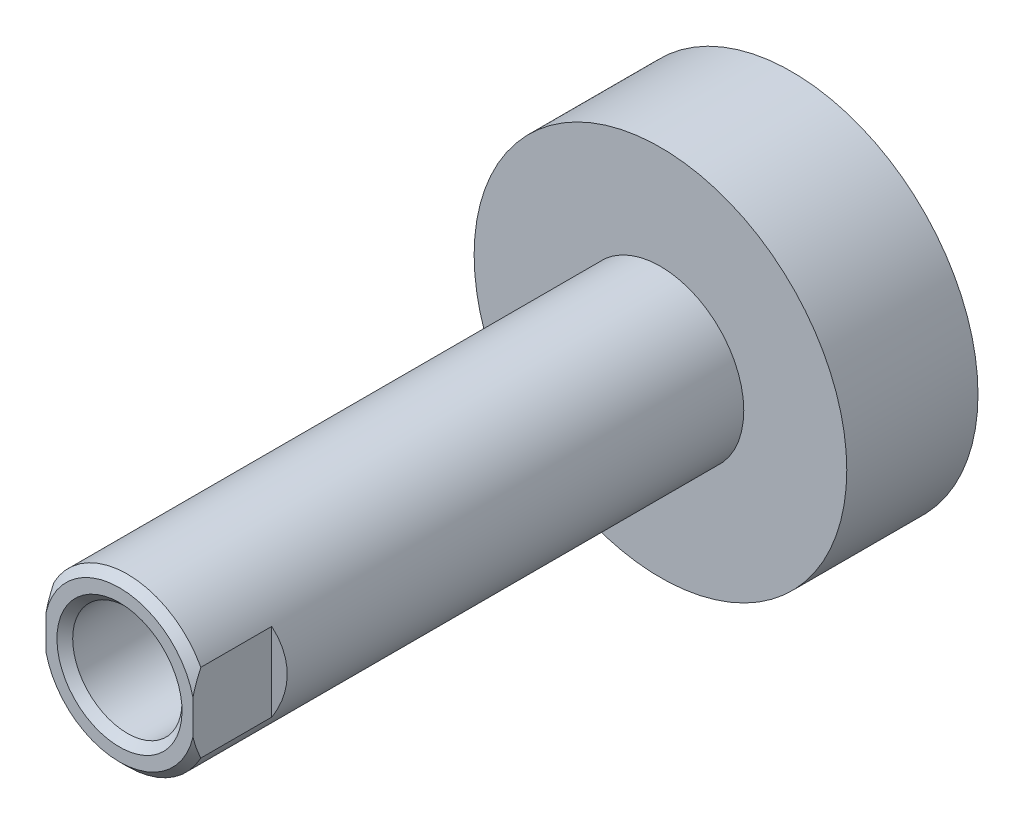
ISO-10303-21;
HEADER;
FILE_DESCRIPTION(('STEP AP214'),'2;1');
FILE_NAME('part.step','',(''),(''),'','','');
FILE_SCHEMA(('AUTOMOTIVE_DESIGN { 1 0 10303 214 1 1 1 1 }'));
ENDSEC;
DATA;
#1=APPLICATION_CONTEXT('core data for automotive mechanical design processes');
#2=APPLICATION_PROTOCOL_DEFINITION('international standard','automotive_design',2000,#1);
#3=PRODUCT_CONTEXT('',#1,'mechanical');
#4=PRODUCT('Part','Part','',(#3));
#5=PRODUCT_RELATED_PRODUCT_CATEGORY('part','',(#4));
#6=PRODUCT_DEFINITION_FORMATION('','',#4);
#7=PRODUCT_DEFINITION_CONTEXT('part definition',#1,'design');
#8=PRODUCT_DEFINITION('design','',#6,#7);
#9=PRODUCT_DEFINITION_SHAPE('','',#8);
#10=(LENGTH_UNIT() NAMED_UNIT(*) SI_UNIT(.MILLI.,.METRE.));
#11=(NAMED_UNIT(*) PLANE_ANGLE_UNIT() SI_UNIT($,.RADIAN.));
#12=(NAMED_UNIT(*) SI_UNIT($,.STERADIAN.) SOLID_ANGLE_UNIT());
#13=UNCERTAINTY_MEASURE_WITH_UNIT(LENGTH_MEASURE(1.E-05),#10,'distance_accuracy_value','');
#14=(GEOMETRIC_REPRESENTATION_CONTEXT(3) GLOBAL_UNCERTAINTY_ASSIGNED_CONTEXT((#13)) GLOBAL_UNIT_ASSIGNED_CONTEXT((#10,
#11,#12)) REPRESENTATION_CONTEXT('',''));
#15=CARTESIAN_POINT('',(0.,0.,0.));
#16=DIRECTION('',(0.,0.,1.));
#17=DIRECTION('',(1.,0.,0.));
#18=AXIS2_PLACEMENT_3D('',#15,#16,#17);
#19=CARTESIAN_POINT('',(0.,0.,25.614));
#20=DIRECTION('',(0.,0.,-1.));
#21=DIRECTION('',(-1.,0.,0.));
#22=AXIS2_PLACEMENT_3D('',#19,#20,#21);
#23=CONICAL_SURFACE('',#22,2.875,0.785398163397448);
#24=CARTESIAN_POINT('',(2.8,6.40409288585039,21.4995504014551));
#25=CARTESIAN_POINT('',(2.8,6.21530131402021,21.6724791142946));
#26=CARTESIAN_POINT('',(2.8,6.02594277949216,21.8447983655281));
#27=CARTESIAN_POINT('',(2.8,5.64560917698831,22.1877342817093));
#28=CARTESIAN_POINT('',(2.8,5.45463373183103,22.3583505279696));
#29=CARTESIAN_POINT('',(2.8,5.0693993005037,22.698438486706));
#30=CARTESIAN_POINT('',(2.8,4.87512693210801,22.8678950791546));
#31=CARTESIAN_POINT('',(2.8,4.48388823614274,23.2036313887583));
#32=CARTESIAN_POINT('',(2.8,4.28692225071637,23.3699115030752));
#33=CARTESIAN_POINT('',(2.8,3.92252866507081,23.670547193242));
#34=CARTESIAN_POINT('',(2.8,3.7556707956785,23.8055906179416));
#35=CARTESIAN_POINT('',(2.8,3.41848834775856,24.0713896916909));
#36=CARTESIAN_POINT('',(2.8,3.24816284560576,24.2021441734836));
#37=CARTESIAN_POINT('',(2.8,2.90310026082264,24.4573200193591));
#38=CARTESIAN_POINT('',(2.8,2.72836898816857,24.5817491319853));
#39=CARTESIAN_POINT('',(2.8,2.46159360059418,24.7613775075954));
#40=CARTESIAN_POINT('',(2.8,2.37190693686156,24.8200734947239));
#41=CARTESIAN_POINT('',(2.8,2.19069178803803,24.9345403791412));
#42=CARTESIAN_POINT('',(2.8,2.09916353869147,24.9903116475729));
#43=CARTESIAN_POINT('',(2.8,1.91535619256872,25.0973786837929));
#44=CARTESIAN_POINT('',(2.8,1.82310918445454,25.1487292209963));
#45=CARTESIAN_POINT('',(2.8,1.6362600728144,25.2469280610082));
#46=CARTESIAN_POINT('',(2.8,1.54165859274646,25.2937775400462));
#47=CARTESIAN_POINT('',(2.8,1.34992491480377,25.3817423789926));
#48=CARTESIAN_POINT('',(2.8,1.25279557260694,25.4228639021425));
#49=CARTESIAN_POINT('',(2.8,1.05579132027353,25.497944220849));
#50=CARTESIAN_POINT('',(2.8,0.955917202290746,25.5319050589735));
#51=CARTESIAN_POINT('',(2.8,0.774015610001933,25.5850128160452));
#52=CARTESIAN_POINT('',(2.8,0.692459969683738,25.605766485837));
#53=CARTESIAN_POINT('',(2.8,0.527974791108671,25.6407885828827));
#54=CARTESIAN_POINT('',(2.8,0.445045717822605,25.6550591602577));
#55=CARTESIAN_POINT('',(2.8,0.278459436251525,25.6763967953165));
#56=CARTESIAN_POINT('',(2.8,0.194804513514793,25.6834814400774));
#57=CARTESIAN_POINT('',(2.8,0.0271926983587925,25.6901200407255));
#58=CARTESIAN_POINT('',(2.8,-0.0567641889013705,25.689674124668));
#59=CARTESIAN_POINT('',(2.8,-0.224256787386011,25.6812791669753));
#60=CARTESIAN_POINT('',(2.8,-0.307792675606,25.6733335991373));
#61=CARTESIAN_POINT('',(2.8,-0.473890294720259,25.6503734951748));
#62=CARTESIAN_POINT('',(2.8,-0.556451813717623,25.6353574494422));
#63=CARTESIAN_POINT('',(2.8,-0.720378465833271,25.5989246360367));
#64=CARTESIAN_POINT('',(2.8,-0.8017395223032,25.5774897621309));
#65=CARTESIAN_POINT('',(2.8,-0.962778849550997,25.5290943027323));
#66=CARTESIAN_POINT('',(2.8,-1.04245714605221,25.5021338017738));
#67=CARTESIAN_POINT('',(2.8,-1.21987368113353,25.4361807538754));
#68=CARTESIAN_POINT('',(2.8,-1.31711815376235,25.3958671833215));
#69=CARTESIAN_POINT('',(2.8,-1.5090017068583,25.3094178174973));
#70=CARTESIAN_POINT('',(2.8,-1.60363955018692,25.2632793137298));
#71=CARTESIAN_POINT('',(2.8,-1.79068294250205,25.1663296497851));
#72=CARTESIAN_POINT('',(2.8,-1.88308428843928,25.1155104419594));
#73=CARTESIAN_POINT('',(2.8,-2.06579163515274,25.0102183243824));
#74=CARTESIAN_POINT('',(2.8,-2.15609721381248,24.9557446870287));
#75=CARTESIAN_POINT('',(2.8,-2.33581888189109,24.8433062497768));
#76=CARTESIAN_POINT('',(2.8,-2.42521574452043,24.7853108566371));
#77=CARTESIAN_POINT('',(2.8,-2.60241554860162,24.6669282900505));
#78=CARTESIAN_POINT('',(2.8,-2.69021835064669,24.6065409088705));
#79=CARTESIAN_POINT('',(2.8,-2.95163931230513,24.4224562849015));
#80=CARTESIAN_POINT('',(2.8,-3.12322091808284,24.2958679924581));
#81=CARTESIAN_POINT('',(2.8,-3.43143863596196,24.0610457530675));
#82=CARTESIAN_POINT('',(2.8,-3.56874079757334,23.9536750622679));
#83=CARTESIAN_POINT('',(2.8,-3.84120420423017,23.7363065843494));
#84=CARTESIAN_POINT('',(2.8,-3.97636586386936,23.6263093165843));
#85=CARTESIAN_POINT('',(2.8,-4.2450954333917,23.4042072896423));
#86=CARTESIAN_POINT('',(2.8,-4.37866219761083,23.2921011488778));
#87=CARTESIAN_POINT('',(2.8,-4.64443688882981,23.0662794076185));
#88=CARTESIAN_POINT('',(2.8,-4.77664474964283,22.9525637293646));
#89=CARTESIAN_POINT('',(2.8,-5.16103062136355,22.6186969018967));
#90=CARTESIAN_POINT('',(2.8,-5.41172447055859,22.3968373546205));
#91=CARTESIAN_POINT('',(2.8,-5.78548758602015,22.0618019699764));
#92=CARTESIAN_POINT('',(2.8,-5.90962703562808,21.9498122892259));
#93=CARTESIAN_POINT('',(2.8,-6.15729395528682,21.7251586496859));
#94=CARTESIAN_POINT('',(2.8,-6.28082142680383,21.6124946925134));
#95=CARTESIAN_POINT('',(2.8,-6.40409288585039,21.4995504014551));
#96=B_SPLINE_CURVE_WITH_KNOTS('',3,(#24,#25,#26,#27,#28,#29,#30,#31,#32,#33,#34,#35,#36,#37,#38,
#39,#40,#41,#42,#43,#44,#45,#46,#47,#48,#49,#50,#51,#52,#53,#54,#55,#56,#57,#58,#59,#60,#61,#62,
#63,#64,#65,#66,#67,#68,#69,#70,#71,#72,#73,#74,#75,#76,#77,#78,#79,#80,#81,#82,#83,#84,#85,#86,
#87,#88,#89,#90,#91,#92,#93,#94,#95),.UNSPECIFIED.,.F.,.F.,(4,2,2,2,2,2,2,2,2,2,2,2,2,2,2,2,2,2,
2,2,2,2,2,2,2,2,2,2,2,2,2,2,2,2,2,4),(0.,0.768070465982802,1.5363253295418,2.3096809370453,
3.08293920886111,3.72686189949449,4.37095840685429,5.01424588420809,5.33576238949962,
5.65723799555331,5.97387016639603,6.29041936764638,6.60662528866313,6.92274089032021,
7.17497877598581,7.42713294564482,7.67866848525018,7.93019974755985,8.18161455912571,
8.4330830742841,8.68526772293323,8.93744851379239,9.25300704333975,9.56871284654274,
9.88497196065974,10.2012942304021,10.5209300388869,10.840593667401,11.4800956660014,
12.0029633797013,12.5257285490226,13.0488490267358,13.571994863987,14.5762479594562,
15.0778149878801,15.5793808140611),.UNSPECIFIED.);
#97=CARTESIAN_POINT('',(2.8,1.49687173799227,25.314));
#98=VERTEX_POINT('',#97);
#99=CARTESIAN_POINT('',(2.8,0.652399417534981,25.614));
#100=VERTEX_POINT('',#99);
#101=EDGE_CURVE('E42',#98,#100,#96,.T.);
#102=ORIENTED_EDGE('',*,*,#101,.F.);
#103=CARTESIAN_POINT('',(0.,0.,25.314));
#104=DIRECTION('',(0.,0.,-1.));
#105=DIRECTION('',(-1.,0.,0.));
#106=AXIS2_PLACEMENT_3D('',#103,#104,#105);
#107=CIRCLE('',#106,3.175);
#108=CARTESIAN_POINT('',(-2.8,1.49687173799227,25.314));
#109=VERTEX_POINT('',#108);
#110=EDGE_CURVE('E114',#109,#98,#107,.T.);
#111=ORIENTED_EDGE('',*,*,#110,.F.);
#112=CARTESIAN_POINT('',(-2.8,-6.40409288585039,21.4995504014551));
#113=CARTESIAN_POINT('',(-2.8,-6.21530131402021,21.6724791142946));
#114=CARTESIAN_POINT('',(-2.8,-6.02594277949216,21.8447983655281));
#115=CARTESIAN_POINT('',(-2.8,-5.64560917698831,22.1877342817093));
#116=CARTESIAN_POINT('',(-2.8,-5.45463373183103,22.3583505279696));
#117=CARTESIAN_POINT('',(-2.8,-5.0693993005037,22.698438486706));
#118=CARTESIAN_POINT('',(-2.8,-4.87512693210801,22.8678950791546));
#119=CARTESIAN_POINT('',(-2.8,-4.48388823614274,23.2036313887583));
#120=CARTESIAN_POINT('',(-2.8,-4.28692225071637,23.3699115030752));
#121=CARTESIAN_POINT('',(-2.8,-3.92252866507082,23.670547193242));
#122=CARTESIAN_POINT('',(-2.8,-3.7556707956785,23.8055906179416));
#123=CARTESIAN_POINT('',(-2.8,-3.41848834775857,24.0713896916909));
#124=CARTESIAN_POINT('',(-2.8,-3.24816284560576,24.2021441734836));
#125=CARTESIAN_POINT('',(-2.8,-2.90310026082264,24.4573200193591));
#126=CARTESIAN_POINT('',(-2.8,-2.72836898816858,24.5817491319853));
#127=CARTESIAN_POINT('',(-2.8,-2.46159360059419,24.7613775075954));
#128=CARTESIAN_POINT('',(-2.8,-2.37190693686157,24.8200734947239));
#129=CARTESIAN_POINT('',(-2.8,-2.19069178803804,24.9345403791412));
#130=CARTESIAN_POINT('',(-2.8,-2.09916353869148,24.9903116475729));
#131=CARTESIAN_POINT('',(-2.8,-1.91535619256873,25.0973786837929));
#132=CARTESIAN_POINT('',(-2.8,-1.82310918445455,25.1487292209963));
#133=CARTESIAN_POINT('',(-2.8,-1.63626007281441,25.2469280610082));
#134=CARTESIAN_POINT('',(-2.8,-1.54165859274646,25.2937775400462));
#135=CARTESIAN_POINT('',(-2.8,-1.34992491480378,25.3817423789926));
#136=CARTESIAN_POINT('',(-2.8,-1.25279557260694,25.4228639021425));
#137=CARTESIAN_POINT('',(-2.8,-1.05579132027354,25.497944220849));
#138=CARTESIAN_POINT('',(-2.8,-0.955917202290754,25.5319050589735));
#139=CARTESIAN_POINT('',(-2.8,-0.774015610001941,25.5850128160452));
#140=CARTESIAN_POINT('',(-2.8,-0.692459969683747,25.605766485837));
#141=CARTESIAN_POINT('',(-2.8,-0.527974791108681,25.6407885828827));
#142=CARTESIAN_POINT('',(-2.8,-0.445045717822614,25.6550591602577));
#143=CARTESIAN_POINT('',(-2.8,-0.278459436251534,25.6763967953165));
#144=CARTESIAN_POINT('',(-2.8,-0.194804513514802,25.6834814400774));
#145=CARTESIAN_POINT('',(-2.8,-0.0271926983588019,25.6901200407255));
#146=CARTESIAN_POINT('',(-2.8,0.056764188901361,25.689674124668));
#147=CARTESIAN_POINT('',(-2.8,0.224256787386001,25.6812791669753));
#148=CARTESIAN_POINT('',(-2.8,0.30779267560599,25.6733335991373));
#149=CARTESIAN_POINT('',(-2.8,0.473890294720248,25.6503734951748));
#150=CARTESIAN_POINT('',(-2.8,0.556451813717612,25.6353574494422));
#151=CARTESIAN_POINT('',(-2.8,0.720378465833261,25.5989246360367));
#152=CARTESIAN_POINT('',(-2.8,0.801739522303191,25.5774897621309));
#153=CARTESIAN_POINT('',(-2.8,0.962778849550988,25.5290943027323));
#154=CARTESIAN_POINT('',(-2.8,1.0424571460522,25.5021338017738));
#155=CARTESIAN_POINT('',(-2.8,1.21987368113352,25.4361807538754));
#156=CARTESIAN_POINT('',(-2.8,1.31711815376234,25.3958671833215));
#157=CARTESIAN_POINT('',(-2.8,1.50900170685829,25.3094178174973));
#158=CARTESIAN_POINT('',(-2.8,1.60363955018691,25.2632793137298));
#159=CARTESIAN_POINT('',(-2.8,1.79068294250204,25.1663296497851));
#160=CARTESIAN_POINT('',(-2.8,1.88308428843926,25.1155104419594));
#161=CARTESIAN_POINT('',(-2.8,2.06579163515272,25.0102183243824));
#162=CARTESIAN_POINT('',(-2.8,2.15609721381246,24.9557446870287));
#163=CARTESIAN_POINT('',(-2.8,2.33581888189107,24.8433062497769));
#164=CARTESIAN_POINT('',(-2.8,2.42521574452041,24.7853108566371));
#165=CARTESIAN_POINT('',(-2.8,2.60241554860159,24.6669282900505));
#166=CARTESIAN_POINT('',(-2.8,2.69021835064666,24.6065409088705));
#167=CARTESIAN_POINT('',(-2.8,2.9516393123051,24.4224562849015));
#168=CARTESIAN_POINT('',(-2.8,3.12322091808282,24.2958679924581));
#169=CARTESIAN_POINT('',(-2.8,3.43143863596193,24.0610457530675));
#170=CARTESIAN_POINT('',(-2.8,3.56874079757331,23.9536750622679));
#171=CARTESIAN_POINT('',(-2.8,3.84120420423014,23.7363065843494));
#172=CARTESIAN_POINT('',(-2.8,3.97636586386934,23.6263093165843));
#173=CARTESIAN_POINT('',(-2.8,4.24509543339167,23.4042072896423));
#174=CARTESIAN_POINT('',(-2.8,4.37866219761081,23.2921011488779));
#175=CARTESIAN_POINT('',(-2.8,4.64443688882979,23.0662794076186));
#176=CARTESIAN_POINT('',(-2.8,4.77664474964281,22.9525637293647));
#177=CARTESIAN_POINT('',(-2.8,5.16103062136353,22.6186969018967));
#178=CARTESIAN_POINT('',(-2.8,5.41172447055858,22.3968373546205));
#179=CARTESIAN_POINT('',(-2.8,5.78548758602014,22.0618019699764));
#180=CARTESIAN_POINT('',(-2.8,5.90962703562807,21.9498122892259));
#181=CARTESIAN_POINT('',(-2.8,6.15729395528682,21.7251586496859));
#182=CARTESIAN_POINT('',(-2.8,6.28082142680382,21.6124946925134));
#183=CARTESIAN_POINT('',(-2.8,6.40409288585039,21.4995504014551));
#184=B_SPLINE_CURVE_WITH_KNOTS('',3,(#112,#113,#114,#115,#116,#117,#118,#119,#120,#121,#122,
#123,#124,#125,#126,#127,#128,#129,#130,#131,#132,#133,#134,#135,#136,#137,#138,#139,#140,#141,
#142,#143,#144,#145,#146,#147,#148,#149,#150,#151,#152,#153,#154,#155,#156,#157,#158,#159,#160,
#161,#162,#163,#164,#165,#166,#167,#168,#169,#170,#171,#172,#173,#174,#175,#176,#177,#178,#179,
#180,#181,#182,#183),.UNSPECIFIED.,.F.,.F.,(4,2,2,2,2,2,2,2,2,2,2,2,2,2,2,2,2,2,2,2,2,2,2,2,2,2,
2,2,2,2,2,2,2,2,2,4),(0.,0.768070465982802,1.5363253295418,2.3096809370453,3.08293920886111,
3.72686189949449,4.37095840685428,5.01424588420809,5.33576238949961,5.6572379955533,
5.97387016639602,6.29041936764637,6.60662528866312,6.9227408903202,7.1749787759858,
7.42713294564481,7.67866848525017,7.93019974755985,8.1816145591257,8.43308307428408,
8.68526772293322,8.93744851379238,9.25300704333974,9.56871284654273,9.88497196065972,
10.2012942304021,10.5209300388869,10.840593667401,11.4800956660014,12.0029633797013,
12.5257285490225,13.0488490267357,13.571994863987,14.5762479594562,15.0778149878801,
15.5793808140611),.UNSPECIFIED.);
#185=CARTESIAN_POINT('',(-2.8,0.652399417534996,25.614));
#186=VERTEX_POINT('',#185);
#187=EDGE_CURVE('E105',#186,#109,#184,.T.);
#188=ORIENTED_EDGE('',*,*,#187,.F.);
#189=CARTESIAN_POINT('',(0.,0.,25.614));
#190=DIRECTION('',(0.,0.,-1.));
#191=DIRECTION('',(0.,1.,0.));
#192=AXIS2_PLACEMENT_3D('',#189,#190,#191);
#193=CIRCLE('',#192,2.875);
#194=EDGE_CURVE('E56',#100,#186,#193,.F.);
#195=ORIENTED_EDGE('',*,*,#194,.F.);
#196=EDGE_LOOP('',(#102,#111,#188,#195));
#197=FACE_BOUND('',#196,.T.);
#198=ADVANCED_FACE('F34',(#197),#23,.T.);
#199=CARTESIAN_POINT('',(0.,0.,5.));
#200=DIRECTION('',(0.,0.,-1.));
#201=DIRECTION('',(-1.,0.,0.));
#202=AXIS2_PLACEMENT_3D('',#199,#200,#201);
#203=CYLINDRICAL_SURFACE('',#202,7.1);
#204=CARTESIAN_POINT('',(0.,0.,5.));
#205=DIRECTION('',(0.,0.,1.));
#206=DIRECTION('',(1.,0.,0.));
#207=AXIS2_PLACEMENT_3D('',#204,#205,#206);
#208=CIRCLE('',#207,7.1);
#209=CARTESIAN_POINT('',(7.1,0.,5.));
#210=VERTEX_POINT('',#209);
#211=EDGE_CURVE('E179',#210,#210,#208,.T.);
#212=ORIENTED_EDGE('',*,*,#211,.F.);
#213=EDGE_LOOP('',(#212));
#214=FACE_BOUND('',#213,.T.);
#215=CARTESIAN_POINT('',(0.,0.,0.));
#216=DIRECTION('',(0.,0.,1.));
#217=DIRECTION('',(1.,0.,0.));
#218=AXIS2_PLACEMENT_3D('',#215,#216,#217);
#219=CIRCLE('',#218,7.1);
#220=CARTESIAN_POINT('',(7.1,0.,0.));
#221=VERTEX_POINT('',#220);
#222=EDGE_CURVE('E182',#221,#221,#219,.T.);
#223=ORIENTED_EDGE('',*,*,#222,.T.);
#224=EDGE_LOOP('',(#223));
#225=FACE_BOUND('',#224,.T.);
#226=ADVANCED_FACE('F167',(#214,#225),#203,.T.);
#227=CARTESIAN_POINT('',(0.,0.,5.));
#228=DIRECTION('',(0.,0.,1.));
#229=DIRECTION('',(1.,0.,0.));
#230=AXIS2_PLACEMENT_3D('',#227,#228,#229);
#231=PLANE('',#230);
#232=CARTESIAN_POINT('',(0.,0.,5.));
#233=DIRECTION('',(0.,0.,1.));
#234=DIRECTION('',(1.,0.,0.));
#235=AXIS2_PLACEMENT_3D('',#232,#233,#234);
#236=CIRCLE('',#235,3.175);
#237=CARTESIAN_POINT('',(3.175,0.,5.));
#238=VERTEX_POINT('',#237);
#239=EDGE_CURVE('E110',#238,#238,#236,.T.);
#240=ORIENTED_EDGE('',*,*,#239,.F.);
#241=EDGE_LOOP('',(#240));
#242=FACE_BOUND('',#241,.T.);
#243=ORIENTED_EDGE('',*,*,#211,.T.);
#244=EDGE_LOOP('',(#243));
#245=FACE_BOUND('',#244,.T.);
#246=ADVANCED_FACE('F164',(#242,#245),#231,.T.);
#247=CARTESIAN_POINT('',(0.,0.,0.));
#248=DIRECTION('',(0.,0.,1.));
#249=DIRECTION('',(1.,0.,0.));
#250=AXIS2_PLACEMENT_3D('',#247,#248,#249);
#251=PLANE('',#250);
#252=ORIENTED_EDGE('',*,*,#222,.F.);
#253=EDGE_LOOP('',(#252));
#254=FACE_BOUND('',#253,.T.);
#255=ADVANCED_FACE('F162',(#254),#251,.F.);
#256=CARTESIAN_POINT('',(0.,0.,34.5942561210692));
#257=DIRECTION('',(0.,0.,-1.));
#258=DIRECTION('',(-1.,0.,0.));
#259=AXIS2_PLACEMENT_3D('',#256,#257,#258);
#260=CYLINDRICAL_SURFACE('',#259,3.175);
#261=DIRECTION('',(0.,0.,-1.));
#262=VECTOR('',#261,1.);
#263=CARTESIAN_POINT('',(2.8,1.49687173799227,34.5942561210692));
#264=LINE('',#263,#262);
#265=CARTESIAN_POINT('',(2.8,1.49687173799227,22.614));
#266=VERTEX_POINT('',#265);
#267=EDGE_CURVE('E91',#266,#98,#264,.F.);
#268=ORIENTED_EDGE('',*,*,#267,.F.);
#269=CARTESIAN_POINT('',(0.,0.,24.230580753731));
#270=DIRECTION('',(-0.500000000000004,0.,-0.866025403784436));
#271=DIRECTION('',(0.866025403784436,0.,-0.500000000000004));
#272=AXIS2_PLACEMENT_3D('',#269,#270,#271);
#273=ELLIPSE('',#272,3.66617420935414,3.175);
#274=CARTESIAN_POINT('',(2.8,-1.49687173799227,22.614));
#275=VERTEX_POINT('',#274);
#276=EDGE_CURVE('E12',#275,#266,#273,.F.);
#277=ORIENTED_EDGE('',*,*,#276,.F.);
#278=DIRECTION('',(0.,0.,-1.));
#279=VECTOR('',#278,1.);
#280=CARTESIAN_POINT('',(2.8,-1.49687173799227,34.5942561210692));
#281=LINE('',#280,#279);
#282=CARTESIAN_POINT('',(2.8,-1.49687173799227,25.314));
#283=VERTEX_POINT('',#282);
#284=EDGE_CURVE('E101',#283,#275,#281,.T.);
#285=ORIENTED_EDGE('',*,*,#284,.F.);
#286=CARTESIAN_POINT('',(-2.8,-1.49687173799227,25.314));
#287=VERTEX_POINT('',#286);
#288=EDGE_CURVE('E108',#283,#287,#107,.T.);
#289=ORIENTED_EDGE('',*,*,#288,.T.);
#290=DIRECTION('',(0.,0.,-1.));
#291=VECTOR('',#290,1.);
#292=CARTESIAN_POINT('',(-2.8,-1.49687173799228,34.5942561210692));
#293=LINE('',#292,#291);
#294=CARTESIAN_POINT('',(-2.8,-1.49687173799228,22.614));
#295=VERTEX_POINT('',#294);
#296=EDGE_CURVE('E196',#295,#287,#293,.F.);
#297=ORIENTED_EDGE('',*,*,#296,.F.);
#298=CARTESIAN_POINT('',(0.,0.,24.230580753731));
#299=DIRECTION('',(0.500000000000004,0.,-0.866025403784437));
#300=DIRECTION('',(-0.866025403784437,0.,-0.500000000000004));
#301=AXIS2_PLACEMENT_3D('',#298,#299,#300);
#302=ELLIPSE('',#301,3.66617420935413,3.175);
#303=CARTESIAN_POINT('',(-2.8,1.49687173799228,22.614));
#304=VERTEX_POINT('',#303);
#305=EDGE_CURVE('E125',#304,#295,#302,.F.);
#306=ORIENTED_EDGE('',*,*,#305,.F.);
#307=DIRECTION('',(0.,0.,-1.));
#308=VECTOR('',#307,1.);
#309=CARTESIAN_POINT('',(-2.8,1.49687173799228,34.5942561210692));
#310=LINE('',#309,#308);
#311=EDGE_CURVE('E199',#109,#304,#310,.T.);
#312=ORIENTED_EDGE('',*,*,#311,.F.);
#313=ORIENTED_EDGE('',*,*,#110,.T.);
#314=EDGE_LOOP('',(#268,#277,#285,#289,#297,#306,#312,#313));
#315=FACE_BOUND('',#314,.T.);
#316=ORIENTED_EDGE('',*,*,#239,.T.);
#317=EDGE_LOOP('',(#316));
#318=FACE_BOUND('',#317,.T.);
#319=ADVANCED_FACE('F159',(#315,#318),#260,.T.);
#320=CARTESIAN_POINT('',(0.,0.,25.614));
#321=DIRECTION('',(0.,0.,-1.));
#322=DIRECTION('',(0.,1.,0.));
#323=AXIS2_PLACEMENT_3D('',#320,#321,#322);
#324=PLANE('',#323);
#325=CARTESIAN_POINT('',(-2.8,-0.652399417534996,25.614));
#326=VERTEX_POINT('',#325);
#327=CARTESIAN_POINT('',(2.8,-0.652399417534984,25.614));
#328=VERTEX_POINT('',#327);
#329=EDGE_CURVE('E100',#326,#328,#193,.F.);
#330=ORIENTED_EDGE('',*,*,#329,.T.);
#331=DIRECTION('',(0.,1.,0.));
#332=VECTOR('',#331,1.);
#333=CARTESIAN_POINT('',(2.8,-7.1,25.614));
#334=LINE('',#333,#332);
#335=EDGE_CURVE('E49',#328,#100,#334,.T.);
#336=ORIENTED_EDGE('',*,*,#335,.T.);
#337=ORIENTED_EDGE('',*,*,#194,.T.);
#338=DIRECTION('',(0.,1.,0.));
#339=VECTOR('',#338,1.);
#340=CARTESIAN_POINT('',(-2.8,-7.1,25.614));
#341=LINE('',#340,#339);
#342=EDGE_CURVE('E202',#326,#186,#341,.T.);
#343=ORIENTED_EDGE('',*,*,#342,.F.);
#344=EDGE_LOOP('',(#330,#336,#337,#343));
#345=FACE_BOUND('',#344,.T.);
#346=CARTESIAN_POINT('',(0.,0.,25.614));
#347=DIRECTION('',(0.,0.,-1.));
#348=DIRECTION('',(0.,1.,0.));
#349=AXIS2_PLACEMENT_3D('',#346,#347,#348);
#350=CIRCLE('',#349,2.3828);
#351=CARTESIAN_POINT('',(0.,2.3828,25.614));
#352=VERTEX_POINT('',#351);
#353=EDGE_CURVE('E106',#352,#352,#350,.T.);
#354=ORIENTED_EDGE('',*,*,#353,.T.);
#355=EDGE_LOOP('',(#354));
#356=FACE_BOUND('',#355,.T.);
#357=ADVANCED_FACE('F97',(#345,#356),#324,.F.);
#358=CARTESIAN_POINT('',(0.,0.,25.614));
#359=DIRECTION('',(0.,0.,1.));
#360=DIRECTION('',(0.,-1.,0.));
#361=AXIS2_PLACEMENT_3D('',#358,#359,#360);
#362=CYLINDRICAL_SURFACE('',#361,2.0828);
#363=CARTESIAN_POINT('',(0.,0.,25.314));
#364=DIRECTION('',(0.,0.,-1.));
#365=DIRECTION('',(0.,1.,0.));
#366=AXIS2_PLACEMENT_3D('',#363,#364,#365);
#367=CIRCLE('',#366,2.0828);
#368=CARTESIAN_POINT('',(0.,2.0828,25.314));
#369=VERTEX_POINT('',#368);
#370=EDGE_CURVE('E116',#369,#369,#367,.F.);
#371=ORIENTED_EDGE('',*,*,#370,.T.);
#372=EDGE_LOOP('',(#371));
#373=FACE_BOUND('',#372,.T.);
#374=CARTESIAN_POINT('',(0.,0.,13.93));
#375=DIRECTION('',(0.,0.,1.));
#376=DIRECTION('',(0.,-1.,0.));
#377=AXIS2_PLACEMENT_3D('',#374,#375,#376);
#378=CIRCLE('',#377,2.0828);
#379=CARTESIAN_POINT('',(0.,-2.0828,13.93));
#380=VERTEX_POINT('',#379);
#381=EDGE_CURVE('E183',#380,#380,#378,.T.);
#382=ORIENTED_EDGE('',*,*,#381,.F.);
#383=EDGE_LOOP('',(#382));
#384=FACE_BOUND('',#383,.T.);
#385=ADVANCED_FACE('F152',(#373,#384),#362,.F.);
#386=CARTESIAN_POINT('',(1.7272,0.,13.93));
#387=DIRECTION('',(0.,0.,-1.));
#388=DIRECTION('',(0.,1.,0.));
#389=AXIS2_PLACEMENT_3D('',#386,#387,#388);
#390=PLANE('',#389);
#391=CARTESIAN_POINT('',(0.,0.,13.93));
#392=DIRECTION('',(0.,0.,1.));
#393=DIRECTION('',(0.,-1.,0.));
#394=AXIS2_PLACEMENT_3D('',#391,#392,#393);
#395=CIRCLE('',#394,1.7272);
#396=CARTESIAN_POINT('',(0.,-1.7272,13.93));
#397=VERTEX_POINT('',#396);
#398=EDGE_CURVE('E186',#397,#397,#395,.T.);
#399=ORIENTED_EDGE('',*,*,#398,.F.);
#400=EDGE_LOOP('',(#399));
#401=FACE_BOUND('',#400,.T.);
#402=ORIENTED_EDGE('',*,*,#381,.T.);
#403=EDGE_LOOP('',(#402));
#404=FACE_BOUND('',#403,.T.);
#405=ADVANCED_FACE('F148',(#401,#404),#390,.F.);
#406=CARTESIAN_POINT('',(0.,0.,25.614));
#407=DIRECTION('',(0.,0.,1.));
#408=DIRECTION('',(0.,-1.,0.));
#409=AXIS2_PLACEMENT_3D('',#406,#407,#408);
#410=CYLINDRICAL_SURFACE('',#409,1.7272);
#411=CARTESIAN_POINT('',(0.,0.,11.53656));
#412=DIRECTION('',(0.,0.,1.));
#413=DIRECTION('',(0.,-1.,0.));
#414=AXIS2_PLACEMENT_3D('',#411,#412,#413);
#415=CIRCLE('',#414,1.7272);
#416=CARTESIAN_POINT('',(0.,-1.7272,11.53656));
#417=VERTEX_POINT('',#416);
#418=EDGE_CURVE('E193',#417,#417,#415,.T.);
#419=ORIENTED_EDGE('',*,*,#418,.F.);
#420=EDGE_LOOP('',(#419));
#421=FACE_BOUND('',#420,.T.);
#422=ORIENTED_EDGE('',*,*,#398,.T.);
#423=EDGE_LOOP('',(#422));
#424=FACE_BOUND('',#423,.T.);
#425=ADVANCED_FACE('F144',(#421,#424),#410,.F.);
#426=CARTESIAN_POINT('',(0.,0.,11.53656));
#427=DIRECTION('',(0.,0.,1.));
#428=DIRECTION('',(0.,-1.,0.));
#429=AXIS2_PLACEMENT_3D('',#426,#427,#428);
#430=CONICAL_SURFACE('',#429,1.7272,1.02974425867665);
#431=CARTESIAN_POINT('',(0.,0.,10.4987535388156));
#432=VERTEX_POINT('',#431);
#433=VERTEX_LOOP('',#432);
#434=FACE_BOUND('',#433,.T.);
#435=ORIENTED_EDGE('',*,*,#418,.T.);
#436=EDGE_LOOP('',(#435));
#437=FACE_BOUND('',#436,.T.);
#438=ADVANCED_FACE('F141',(#434,#437),#430,.F.);
#439=EDGE_CURVE('E95',#328,#283,#96,.T.);
#440=ORIENTED_EDGE('',*,*,#439,.F.);
#441=ORIENTED_EDGE('',*,*,#329,.F.);
#442=EDGE_CURVE('E124',#287,#326,#184,.T.);
#443=ORIENTED_EDGE('',*,*,#442,.F.);
#444=ORIENTED_EDGE('',*,*,#288,.F.);
#445=EDGE_LOOP('',(#440,#441,#443,#444));
#446=FACE_BOUND('',#445,.T.);
#447=ADVANCED_FACE('F126',(#446),#23,.T.);
#448=CARTESIAN_POINT('',(0.,0.,25.314));
#449=DIRECTION('',(0.,0.,1.));
#450=DIRECTION('',(0.,-1.,0.));
#451=AXIS2_PLACEMENT_3D('',#448,#449,#450);
#452=CONICAL_SURFACE('',#451,2.0828,0.785398163397444);
#453=ORIENTED_EDGE('',*,*,#353,.F.);
#454=EDGE_LOOP('',(#453));
#455=FACE_BOUND('',#454,.T.);
#456=ORIENTED_EDGE('',*,*,#370,.F.);
#457=EDGE_LOOP('',(#456));
#458=FACE_BOUND('',#457,.T.);
#459=ADVANCED_FACE('F36',(#455,#458),#452,.F.);
#460=CARTESIAN_POINT('',(-2.8,-7.1,22.614));
#461=DIRECTION('',(0.500000000000004,0.,-0.866025403784437));
#462=DIRECTION('',(-0.866025403784437,0.,-0.500000000000004));
#463=AXIS2_PLACEMENT_3D('',#460,#461,#462);
#464=PLANE('',#463);
#465=ORIENTED_EDGE('',*,*,#305,.T.);
#466=DIRECTION('',(0.,1.,0.));
#467=VECTOR('',#466,1.);
#468=CARTESIAN_POINT('',(-2.8,-7.1,22.614));
#469=LINE('',#468,#467);
#470=EDGE_CURVE('E201',#295,#304,#469,.T.);
#471=ORIENTED_EDGE('',*,*,#470,.T.);
#472=EDGE_LOOP('',(#465,#471));
#473=FACE_BOUND('',#472,.T.);
#474=ADVANCED_FACE('F135',(#473),#464,.F.);
#475=CARTESIAN_POINT('',(-2.8,-7.1,25.614));
#476=DIRECTION('',(1.,0.,0.));
#477=DIRECTION('',(0.,0.,-1.));
#478=AXIS2_PLACEMENT_3D('',#475,#476,#477);
#479=PLANE('',#478);
#480=ORIENTED_EDGE('',*,*,#296,.T.);
#481=ORIENTED_EDGE('',*,*,#442,.T.);
#482=ORIENTED_EDGE('',*,*,#342,.T.);
#483=ORIENTED_EDGE('',*,*,#187,.T.);
#484=ORIENTED_EDGE('',*,*,#311,.T.);
#485=ORIENTED_EDGE('',*,*,#470,.F.);
#486=EDGE_LOOP('',(#480,#481,#482,#483,#484,#485));
#487=FACE_BOUND('',#486,.T.);
#488=ADVANCED_FACE('F129',(#487),#479,.F.);
#489=CARTESIAN_POINT('',(2.8,-7.1,22.614));
#490=DIRECTION('',(-0.500000000000004,0.,-0.866025403784436));
#491=DIRECTION('',(-0.866025403784436,0.,0.500000000000004));
#492=AXIS2_PLACEMENT_3D('',#489,#490,#491);
#493=PLANE('',#492);
#494=ORIENTED_EDGE('',*,*,#276,.T.);
#495=DIRECTION('',(0.,1.,0.));
#496=VECTOR('',#495,1.);
#497=CARTESIAN_POINT('',(2.8,-7.1,22.614));
#498=LINE('',#497,#496);
#499=EDGE_CURVE('E102',#275,#266,#498,.T.);
#500=ORIENTED_EDGE('',*,*,#499,.F.);
#501=EDGE_LOOP('',(#494,#500));
#502=FACE_BOUND('',#501,.T.);
#503=ADVANCED_FACE('F134',(#502),#493,.F.);
#504=CARTESIAN_POINT('',(2.8,-7.1,25.614));
#505=DIRECTION('',(-1.,0.,0.));
#506=DIRECTION('',(0.,0.,1.));
#507=AXIS2_PLACEMENT_3D('',#504,#505,#506);
#508=PLANE('',#507);
#509=ORIENTED_EDGE('',*,*,#267,.T.);
#510=ORIENTED_EDGE('',*,*,#101,.T.);
#511=ORIENTED_EDGE('',*,*,#335,.F.);
#512=ORIENTED_EDGE('',*,*,#439,.T.);
#513=ORIENTED_EDGE('',*,*,#284,.T.);
#514=ORIENTED_EDGE('',*,*,#499,.T.);
#515=EDGE_LOOP('',(#509,#510,#511,#512,#513,#514));
#516=FACE_BOUND('',#515,.T.);
#517=ADVANCED_FACE('F88',(#516),#508,.F.);
#518=CLOSED_SHELL('',(#198,#226,#246,#255,#319,#357,#385,#405,#425,#438,#447,#459,#474,#488,
#503,#517));
#519=MANIFOLD_SOLID_BREP('B2',#518);
#520=ADVANCED_BREP_SHAPE_REPRESENTATION('',(#18,#519),#14);
#521=SHAPE_DEFINITION_REPRESENTATION(#9,#520);
ENDSEC;
END-ISO-10303-21;
